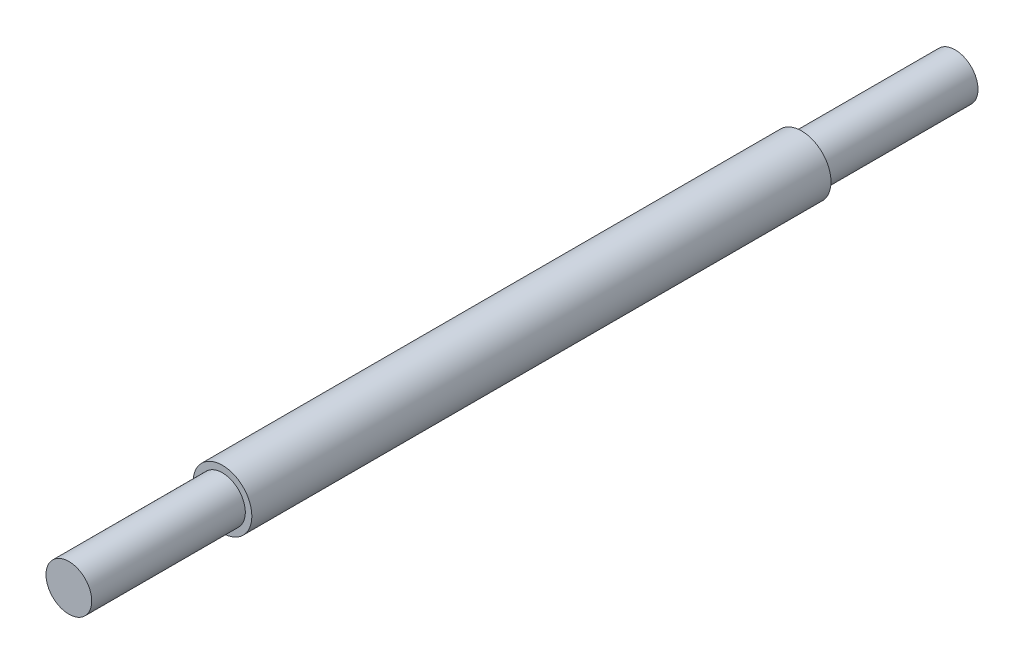
ISO-10303-21;
HEADER;
FILE_DESCRIPTION(('STEP AP214'),'2;1');
FILE_NAME('part.step','',(''),(''),'','','');
FILE_SCHEMA(('AUTOMOTIVE_DESIGN { 1 0 10303 214 1 1 1 1 }'));
ENDSEC;
DATA;
#1=APPLICATION_CONTEXT('core data for automotive mechanical design processes');
#2=APPLICATION_PROTOCOL_DEFINITION('international standard','automotive_design',2000,#1);
#3=PRODUCT_CONTEXT('',#1,'mechanical');
#4=PRODUCT('Part','Part','',(#3));
#5=PRODUCT_RELATED_PRODUCT_CATEGORY('part','',(#4));
#6=PRODUCT_DEFINITION_FORMATION('','',#4);
#7=PRODUCT_DEFINITION_CONTEXT('part definition',#1,'design');
#8=PRODUCT_DEFINITION('design','',#6,#7);
#9=PRODUCT_DEFINITION_SHAPE('','',#8);
#10=(LENGTH_UNIT() NAMED_UNIT(*) SI_UNIT(.MILLI.,.METRE.));
#11=(NAMED_UNIT(*) PLANE_ANGLE_UNIT() SI_UNIT($,.RADIAN.));
#12=(NAMED_UNIT(*) SI_UNIT($,.STERADIAN.) SOLID_ANGLE_UNIT());
#13=UNCERTAINTY_MEASURE_WITH_UNIT(LENGTH_MEASURE(1.E-05),#10,'distance_accuracy_value','');
#14=(GEOMETRIC_REPRESENTATION_CONTEXT(3) GLOBAL_UNCERTAINTY_ASSIGNED_CONTEXT((#13)) GLOBAL_UNIT_ASSIGNED_CONTEXT((#10,
#11,#12)) REPRESENTATION_CONTEXT('',''));
#15=CARTESIAN_POINT('',(0.,0.,0.));
#16=DIRECTION('',(0.,0.,1.));
#17=DIRECTION('',(1.,0.,0.));
#18=AXIS2_PLACEMENT_3D('',#15,#16,#17);
#19=CARTESIAN_POINT('',(0.,0.,70.9));
#20=DIRECTION('',(0.,0.,-1.));
#21=DIRECTION('',(-1.,0.,0.));
#22=AXIS2_PLACEMENT_3D('',#19,#20,#21);
#23=CYLINDRICAL_SURFACE('',#22,3.6);
#24=CARTESIAN_POINT('',(0.,0.,70.9));
#25=DIRECTION('',(0.,0.,1.));
#26=DIRECTION('',(1.,0.,0.));
#27=AXIS2_PLACEMENT_3D('',#24,#25,#26);
#28=CIRCLE('',#27,3.6);
#29=CARTESIAN_POINT('',(3.6,0.,70.9));
#30=VERTEX_POINT('',#29);
#31=EDGE_CURVE('E51',#30,#30,#28,.T.);
#32=ORIENTED_EDGE('',*,*,#31,.F.);
#33=EDGE_LOOP('',(#32));
#34=FACE_BOUND('',#33,.T.);
#35=CARTESIAN_POINT('',(0.,0.,0.));
#36=DIRECTION('',(0.,0.,1.));
#37=DIRECTION('',(1.,0.,0.));
#38=AXIS2_PLACEMENT_3D('',#35,#36,#37);
#39=CIRCLE('',#38,3.6);
#40=CARTESIAN_POINT('',(3.6,0.,0.));
#41=VERTEX_POINT('',#40);
#42=EDGE_CURVE('E40',#41,#41,#39,.T.);
#43=ORIENTED_EDGE('',*,*,#42,.T.);
#44=EDGE_LOOP('',(#43));
#45=FACE_BOUND('',#44,.T.);
#46=ADVANCED_FACE('F37',(#34,#45),#23,.T.);
#47=CARTESIAN_POINT('',(0.,0.,70.9));
#48=DIRECTION('',(0.,0.,1.));
#49=DIRECTION('',(1.,0.,0.));
#50=AXIS2_PLACEMENT_3D('',#47,#48,#49);
#51=PLANE('',#50);
#52=CARTESIAN_POINT('',(0.,0.,70.9));
#53=DIRECTION('',(0.,0.,1.));
#54=DIRECTION('',(1.,0.,0.));
#55=AXIS2_PLACEMENT_3D('',#52,#53,#54);
#56=CIRCLE('',#55,2.8);
#57=CARTESIAN_POINT('',(-2.8,0.,70.9));
#58=VERTEX_POINT('',#57);
#59=EDGE_CURVE('E45',#58,#58,#56,.T.);
#60=ORIENTED_EDGE('',*,*,#59,.F.);
#61=EDGE_LOOP('',(#60));
#62=FACE_BOUND('',#61,.T.);
#63=ORIENTED_EDGE('',*,*,#31,.T.);
#64=EDGE_LOOP('',(#63));
#65=FACE_BOUND('',#64,.T.);
#66=ADVANCED_FACE('F71',(#62,#65),#51,.T.);
#67=CARTESIAN_POINT('',(0.,0.,0.));
#68=DIRECTION('',(0.,0.,1.));
#69=DIRECTION('',(1.,0.,0.));
#70=AXIS2_PLACEMENT_3D('',#67,#68,#69);
#71=PLANE('',#70);
#72=CARTESIAN_POINT('',(0.,0.,0.));
#73=DIRECTION('',(0.,0.,-1.));
#74=DIRECTION('',(-1.,0.,0.));
#75=AXIS2_PLACEMENT_3D('',#72,#73,#74);
#76=CIRCLE('',#75,2.8);
#77=CARTESIAN_POINT('',(2.8,0.,0.));
#78=VERTEX_POINT('',#77);
#79=EDGE_CURVE('E10',#78,#78,#76,.T.);
#80=ORIENTED_EDGE('',*,*,#79,.F.);
#81=EDGE_LOOP('',(#80));
#82=FACE_BOUND('',#81,.T.);
#83=ORIENTED_EDGE('',*,*,#42,.F.);
#84=EDGE_LOOP('',(#83));
#85=FACE_BOUND('',#84,.T.);
#86=ADVANCED_FACE('F68',(#82,#85),#71,.F.);
#87=CARTESIAN_POINT('',(0.,0.,89.7));
#88=DIRECTION('',(0.,0.,-1.));
#89=DIRECTION('',(-1.,0.,0.));
#90=AXIS2_PLACEMENT_3D('',#87,#88,#89);
#91=CYLINDRICAL_SURFACE('',#90,2.8);
#92=CARTESIAN_POINT('',(0.,0.,89.7));
#93=DIRECTION('',(0.,0.,1.));
#94=DIRECTION('',(1.,0.,0.));
#95=AXIS2_PLACEMENT_3D('',#92,#93,#94);
#96=CIRCLE('',#95,2.8);
#97=CARTESIAN_POINT('',(-2.8,0.,89.7));
#98=VERTEX_POINT('',#97);
#99=EDGE_CURVE('E56',#98,#98,#96,.T.);
#100=CARTESIAN_POINT('',(-2.8,0.,89.7));
#101=CARTESIAN_POINT('',(-2.8,0.,89.5041666666667));
#102=CARTESIAN_POINT('',(-2.8,0.,89.3083333333333));
#103=CARTESIAN_POINT('',(-2.8,0.,88.9166666666667));
#104=CARTESIAN_POINT('',(-2.8,0.,88.7208333333333));
#105=CARTESIAN_POINT('',(-2.8,0.,88.3291666666667));
#106=CARTESIAN_POINT('',(-2.8,0.,88.1333333333333));
#107=CARTESIAN_POINT('',(-2.8,0.,87.7416666666667));
#108=CARTESIAN_POINT('',(-2.8,0.,87.5458333333333));
#109=CARTESIAN_POINT('',(-2.8,0.,87.1541666666667));
#110=CARTESIAN_POINT('',(-2.8,0.,86.9583333333333));
#111=CARTESIAN_POINT('',(-2.8,0.,86.5666666666667));
#112=CARTESIAN_POINT('',(-2.8,0.,86.3708333333333));
#113=CARTESIAN_POINT('',(-2.8,0.,85.9791666666667));
#114=CARTESIAN_POINT('',(-2.8,0.,85.7833333333333));
#115=CARTESIAN_POINT('',(-2.8,0.,85.3916666666667));
#116=CARTESIAN_POINT('',(-2.8,0.,85.1958333333333));
#117=CARTESIAN_POINT('',(-2.8,0.,84.8041666666667));
#118=CARTESIAN_POINT('',(-2.8,0.,84.6083333333333));
#119=CARTESIAN_POINT('',(-2.8,0.,84.2166666666667));
#120=CARTESIAN_POINT('',(-2.8,0.,84.0208333333333));
#121=CARTESIAN_POINT('',(-2.8,0.,83.6291666666667));
#122=CARTESIAN_POINT('',(-2.8,0.,83.4333333333333));
#123=CARTESIAN_POINT('',(-2.8,0.,83.0416666666667));
#124=CARTESIAN_POINT('',(-2.8,0.,82.8458333333333));
#125=CARTESIAN_POINT('',(-2.8,0.,82.4541666666667));
#126=CARTESIAN_POINT('',(-2.8,0.,82.2583333333333));
#127=CARTESIAN_POINT('',(-2.8,0.,81.8666666666667));
#128=CARTESIAN_POINT('',(-2.8,0.,81.6708333333333));
#129=CARTESIAN_POINT('',(-2.8,0.,81.2791666666667));
#130=CARTESIAN_POINT('',(-2.8,0.,81.0833333333333));
#131=CARTESIAN_POINT('',(-2.8,0.,80.6916666666667));
#132=CARTESIAN_POINT('',(-2.8,0.,80.4958333333333));
#133=CARTESIAN_POINT('',(-2.8,0.,80.1041666666667));
#134=CARTESIAN_POINT('',(-2.8,0.,79.9083333333333));
#135=CARTESIAN_POINT('',(-2.8,0.,79.5166666666667));
#136=CARTESIAN_POINT('',(-2.8,0.,79.3208333333333));
#137=CARTESIAN_POINT('',(-2.8,0.,78.9291666666667));
#138=CARTESIAN_POINT('',(-2.8,0.,78.7333333333333));
#139=CARTESIAN_POINT('',(-2.8,0.,78.3416666666667));
#140=CARTESIAN_POINT('',(-2.8,0.,78.1458333333333));
#141=CARTESIAN_POINT('',(-2.8,0.,77.7541666666667));
#142=CARTESIAN_POINT('',(-2.8,0.,77.5583333333333));
#143=CARTESIAN_POINT('',(-2.8,0.,77.1666666666667));
#144=CARTESIAN_POINT('',(-2.8,0.,76.9708333333333));
#145=CARTESIAN_POINT('',(-2.8,0.,76.5791666666667));
#146=CARTESIAN_POINT('',(-2.8,0.,76.3833333333333));
#147=CARTESIAN_POINT('',(-2.8,0.,75.9916666666667));
#148=CARTESIAN_POINT('',(-2.8,0.,75.7958333333333));
#149=CARTESIAN_POINT('',(-2.8,0.,75.4041666666667));
#150=CARTESIAN_POINT('',(-2.8,0.,75.2083333333333));
#151=CARTESIAN_POINT('',(-2.8,0.,74.8166666666667));
#152=CARTESIAN_POINT('',(-2.8,0.,74.6208333333333));
#153=CARTESIAN_POINT('',(-2.8,0.,74.2291666666667));
#154=CARTESIAN_POINT('',(-2.8,0.,74.0333333333333));
#155=CARTESIAN_POINT('',(-2.8,0.,73.6416666666667));
#156=CARTESIAN_POINT('',(-2.8,0.,73.4458333333333));
#157=CARTESIAN_POINT('',(-2.8,0.,73.0541666666667));
#158=CARTESIAN_POINT('',(-2.8,0.,72.8583333333333));
#159=CARTESIAN_POINT('',(-2.8,0.,72.4666666666667));
#160=CARTESIAN_POINT('',(-2.8,0.,72.2708333333333));
#161=CARTESIAN_POINT('',(-2.8,0.,71.8791666666667));
#162=CARTESIAN_POINT('',(-2.8,0.,71.6833333333333));
#163=CARTESIAN_POINT('',(-2.8,0.,71.2916666666667));
#164=CARTESIAN_POINT('',(-2.8,0.,71.0958333333333));
#165=CARTESIAN_POINT('',(-2.8,0.,70.9));
#166=B_SPLINE_CURVE_WITH_KNOTS('',3,(#100,#101,#102,#103,#104,#105,#106,#107,#108,#109,#110,
#111,#112,#113,#114,#115,#116,#117,#118,#119,#120,#121,#122,#123,#124,#125,#126,#127,#128,#129,
#130,#131,#132,#133,#134,#135,#136,#137,#138,#139,#140,#141,#142,#143,#144,#145,#146,#147,#148,
#149,#150,#151,#152,#153,#154,#155,#156,#157,#158,#159,#160,#161,#162,#163,#164,#165),
.UNSPECIFIED.,.F.,.F.,(4,2,2,2,2,2,2,2,2,2,2,2,2,2,2,2,2,2,2,2,2,2,2,2,2,2,2,2,2,2,2,2,4),(0.,
0.587499999999991,1.175,1.76249999999999,2.34999999999999,2.9375,3.52499999999999,
4.11249999999999,4.7,5.28749999999999,5.87499999999999,6.4625,7.04999999999999,7.63749999999999,
8.225,8.81249999999999,9.39999999999999,9.9875,10.575,11.1625,11.75,12.3375,12.925,13.5125,14.1,
14.6875,15.275,15.8625,16.45,17.0375,17.625,18.2125,18.8),.UNSPECIFIED.);
#167=EDGE_CURVE('BSEAM70',#98,#58,#166,.T.);
#168=ORIENTED_EDGE('',*,*,#99,.F.);
#169=ORIENTED_EDGE('',*,*,#59,.T.);
#170=ORIENTED_EDGE('',*,*,#167,.T.);
#171=ORIENTED_EDGE('',*,*,#167,.F.);
#172=EDGE_LOOP('',(#168,#170,#169,#171));
#173=FACE_BOUND('',#172,.T.);
#174=ADVANCED_FACE('F70',(#173),#91,.T.);
#175=CARTESIAN_POINT('',(0.,0.,89.7));
#176=DIRECTION('',(0.,0.,1.));
#177=DIRECTION('',(1.,0.,0.));
#178=AXIS2_PLACEMENT_3D('',#175,#176,#177);
#179=PLANE('',#178);
#180=ORIENTED_EDGE('',*,*,#99,.T.);
#181=EDGE_LOOP('',(#180));
#182=FACE_BOUND('',#181,.T.);
#183=ADVANCED_FACE('F77',(#182),#179,.T.);
#184=CARTESIAN_POINT('',(0.,0.,-18.8));
#185=DIRECTION('',(0.,0.,1.));
#186=DIRECTION('',(1.,0.,0.));
#187=AXIS2_PLACEMENT_3D('',#184,#185,#186);
#188=CYLINDRICAL_SURFACE('',#187,2.8);
#189=CARTESIAN_POINT('',(0.,0.,-18.8));
#190=DIRECTION('',(0.,0.,-1.));
#191=DIRECTION('',(-1.,0.,0.));
#192=AXIS2_PLACEMENT_3D('',#189,#190,#191);
#193=CIRCLE('',#192,2.8);
#194=CARTESIAN_POINT('',(2.8,0.,-18.8));
#195=VERTEX_POINT('',#194);
#196=EDGE_CURVE('E55',#195,#195,#193,.T.);
#197=CARTESIAN_POINT('',(2.8,0.,-18.8));
#198=CARTESIAN_POINT('',(2.8,0.,-18.6041666666667));
#199=CARTESIAN_POINT('',(2.8,0.,-18.4083333333333));
#200=CARTESIAN_POINT('',(2.8,0.,-18.0166666666667));
#201=CARTESIAN_POINT('',(2.8,0.,-17.8208333333333));
#202=CARTESIAN_POINT('',(2.8,0.,-17.4291666666667));
#203=CARTESIAN_POINT('',(2.8,0.,-17.2333333333333));
#204=CARTESIAN_POINT('',(2.8,0.,-16.8416666666667));
#205=CARTESIAN_POINT('',(2.8,0.,-16.6458333333333));
#206=CARTESIAN_POINT('',(2.8,0.,-16.2541666666667));
#207=CARTESIAN_POINT('',(2.8,0.,-16.0583333333333));
#208=CARTESIAN_POINT('',(2.8,0.,-15.6666666666667));
#209=CARTESIAN_POINT('',(2.8,0.,-15.4708333333333));
#210=CARTESIAN_POINT('',(2.8,0.,-15.0791666666667));
#211=CARTESIAN_POINT('',(2.8,0.,-14.8833333333333));
#212=CARTESIAN_POINT('',(2.8,0.,-14.4916666666667));
#213=CARTESIAN_POINT('',(2.8,0.,-14.2958333333333));
#214=CARTESIAN_POINT('',(2.8,0.,-13.9041666666667));
#215=CARTESIAN_POINT('',(2.8,0.,-13.7083333333333));
#216=CARTESIAN_POINT('',(2.8,0.,-13.3166666666667));
#217=CARTESIAN_POINT('',(2.8,0.,-13.1208333333333));
#218=CARTESIAN_POINT('',(2.8,0.,-12.7291666666667));
#219=CARTESIAN_POINT('',(2.8,0.,-12.5333333333333));
#220=CARTESIAN_POINT('',(2.8,0.,-12.1416666666667));
#221=CARTESIAN_POINT('',(2.8,0.,-11.9458333333333));
#222=CARTESIAN_POINT('',(2.8,0.,-11.5541666666667));
#223=CARTESIAN_POINT('',(2.8,0.,-11.3583333333333));
#224=CARTESIAN_POINT('',(2.8,0.,-10.9666666666667));
#225=CARTESIAN_POINT('',(2.8,0.,-10.7708333333333));
#226=CARTESIAN_POINT('',(2.8,0.,-10.3791666666667));
#227=CARTESIAN_POINT('',(2.8,0.,-10.1833333333333));
#228=CARTESIAN_POINT('',(2.8,0.,-9.79166666666666));
#229=CARTESIAN_POINT('',(2.8,0.,-9.59583333333333));
#230=CARTESIAN_POINT('',(2.8,0.,-9.20416666666666));
#231=CARTESIAN_POINT('',(2.8,0.,-9.00833333333333));
#232=CARTESIAN_POINT('',(2.8,0.,-8.61666666666666));
#233=CARTESIAN_POINT('',(2.8,0.,-8.42083333333333));
#234=CARTESIAN_POINT('',(2.8,0.,-8.02916666666666));
#235=CARTESIAN_POINT('',(2.8,0.,-7.83333333333333));
#236=CARTESIAN_POINT('',(2.8,0.,-7.44166666666666));
#237=CARTESIAN_POINT('',(2.8,0.,-7.24583333333333));
#238=CARTESIAN_POINT('',(2.8,0.,-6.85416666666666));
#239=CARTESIAN_POINT('',(2.8,0.,-6.65833333333333));
#240=CARTESIAN_POINT('',(2.8,0.,-6.26666666666666));
#241=CARTESIAN_POINT('',(2.8,0.,-6.07083333333333));
#242=CARTESIAN_POINT('',(2.8,0.,-5.67916666666666));
#243=CARTESIAN_POINT('',(2.8,0.,-5.48333333333333));
#244=CARTESIAN_POINT('',(2.8,0.,-5.09166666666666));
#245=CARTESIAN_POINT('',(2.8,0.,-4.89583333333333));
#246=CARTESIAN_POINT('',(2.8,0.,-4.50416666666666));
#247=CARTESIAN_POINT('',(2.8,0.,-4.30833333333333));
#248=CARTESIAN_POINT('',(2.8,0.,-3.91666666666666));
#249=CARTESIAN_POINT('',(2.8,0.,-3.72083333333333));
#250=CARTESIAN_POINT('',(2.8,0.,-3.32916666666666));
#251=CARTESIAN_POINT('',(2.8,0.,-3.13333333333333));
#252=CARTESIAN_POINT('',(2.8,0.,-2.74166666666666));
#253=CARTESIAN_POINT('',(2.8,0.,-2.54583333333333));
#254=CARTESIAN_POINT('',(2.8,0.,-2.15416666666666));
#255=CARTESIAN_POINT('',(2.8,0.,-1.95833333333333));
#256=CARTESIAN_POINT('',(2.8,0.,-1.56666666666666));
#257=CARTESIAN_POINT('',(2.8,0.,-1.37083333333333));
#258=CARTESIAN_POINT('',(2.8,0.,-0.979166666666663));
#259=CARTESIAN_POINT('',(2.8,0.,-0.78333333333333));
#260=CARTESIAN_POINT('',(2.8,0.,-0.391666666666664));
#261=CARTESIAN_POINT('',(2.8,0.,-0.19583333333333));
#262=CARTESIAN_POINT('',(2.8,0.,0.));
#263=B_SPLINE_CURVE_WITH_KNOTS('',3,(#197,#198,#199,#200,#201,#202,#203,#204,#205,#206,#207,
#208,#209,#210,#211,#212,#213,#214,#215,#216,#217,#218,#219,#220,#221,#222,#223,#224,#225,#226,
#227,#228,#229,#230,#231,#232,#233,#234,#235,#236,#237,#238,#239,#240,#241,#242,#243,#244,#245,
#246,#247,#248,#249,#250,#251,#252,#253,#254,#255,#256,#257,#258,#259,#260,#261,#262),
.UNSPECIFIED.,.F.,.F.,(4,2,2,2,2,2,2,2,2,2,2,2,2,2,2,2,2,2,2,2,2,2,2,2,2,2,2,2,2,2,2,2,4),(0.,
0.587499999999998,1.175,1.7625,2.35,2.9375,3.525,4.1125,4.7,5.2875,5.875,6.4625,7.05,7.6375,
8.225,8.8125,9.4,9.9875,10.575,11.1625,11.75,12.3375,12.925,13.5125,14.1,14.6875,15.275,15.8625,
16.45,17.0375,17.625,18.2125,18.8),.UNSPECIFIED.);
#264=EDGE_CURVE('BSEAM105',#195,#78,#263,.T.);
#265=ORIENTED_EDGE('',*,*,#196,.F.);
#266=ORIENTED_EDGE('',*,*,#79,.T.);
#267=ORIENTED_EDGE('',*,*,#264,.T.);
#268=ORIENTED_EDGE('',*,*,#264,.F.);
#269=EDGE_LOOP('',(#265,#267,#266,#268));
#270=FACE_BOUND('',#269,.T.);
#271=ADVANCED_FACE('F105',(#270),#188,.T.);
#272=CARTESIAN_POINT('',(0.,0.,-18.8));
#273=DIRECTION('',(0.,0.,-1.));
#274=DIRECTION('',(-1.,0.,0.));
#275=AXIS2_PLACEMENT_3D('',#272,#273,#274);
#276=PLANE('',#275);
#277=ORIENTED_EDGE('',*,*,#196,.T.);
#278=EDGE_LOOP('',(#277));
#279=FACE_BOUND('',#278,.T.);
#280=ADVANCED_FACE('F119',(#279),#276,.T.);
#281=CLOSED_SHELL('',(#46,#66,#86,#174,#183,#271,#280));
#282=MANIFOLD_SOLID_BREP('B2',#281);
#283=ADVANCED_BREP_SHAPE_REPRESENTATION('',(#18,#282),#14);
#284=SHAPE_DEFINITION_REPRESENTATION(#9,#283);
ENDSEC;
END-ISO-10303-21;
